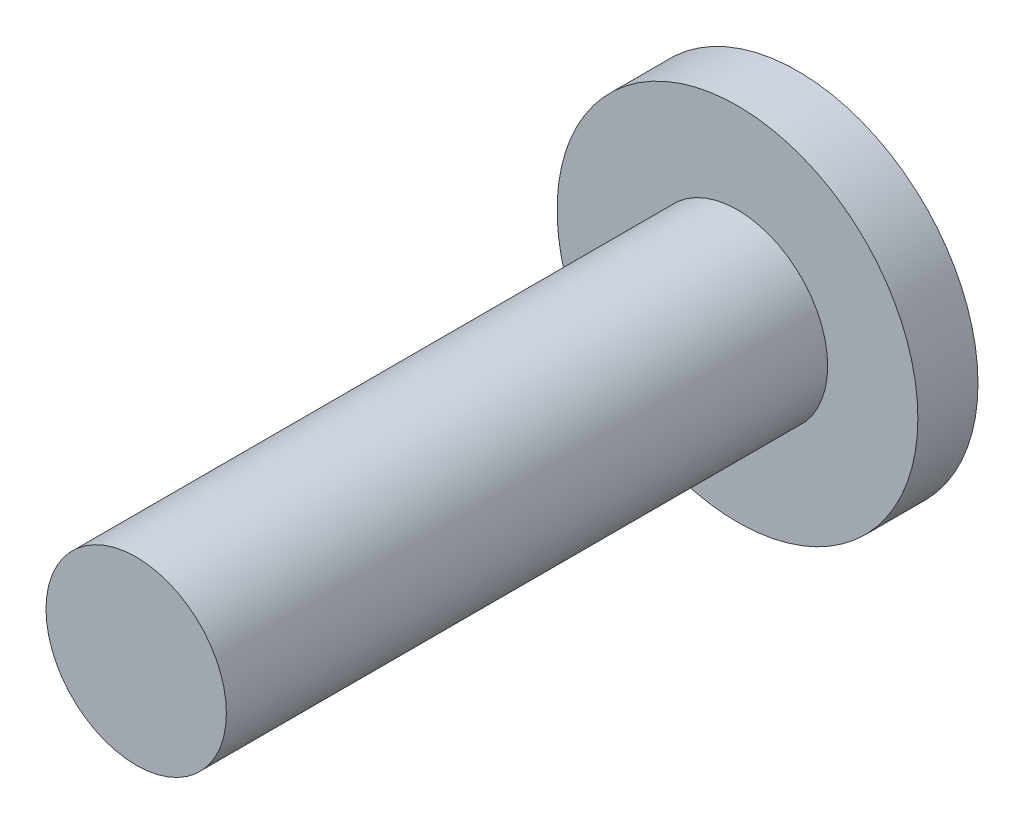
ISO-10303-21;
HEADER;
FILE_DESCRIPTION(('STEP AP214'),'2;1');
FILE_NAME('part.step','',(''),(''),'','','');
FILE_SCHEMA(('AUTOMOTIVE_DESIGN { 1 0 10303 214 1 1 1 1 }'));
ENDSEC;
DATA;
#1=APPLICATION_CONTEXT('core data for automotive mechanical design processes');
#2=APPLICATION_PROTOCOL_DEFINITION('international standard','automotive_design',2000,#1);
#3=PRODUCT_CONTEXT('',#1,'mechanical');
#4=PRODUCT('Part','Part','',(#3));
#5=PRODUCT_RELATED_PRODUCT_CATEGORY('part','',(#4));
#6=PRODUCT_DEFINITION_FORMATION('','',#4);
#7=PRODUCT_DEFINITION_CONTEXT('part definition',#1,'design');
#8=PRODUCT_DEFINITION('design','',#6,#7);
#9=PRODUCT_DEFINITION_SHAPE('','',#8);
#10=(LENGTH_UNIT() NAMED_UNIT(*) SI_UNIT(.MILLI.,.METRE.));
#11=(NAMED_UNIT(*) PLANE_ANGLE_UNIT() SI_UNIT($,.RADIAN.));
#12=(NAMED_UNIT(*) SI_UNIT($,.STERADIAN.) SOLID_ANGLE_UNIT());
#13=UNCERTAINTY_MEASURE_WITH_UNIT(LENGTH_MEASURE(1.E-05),#10,'distance_accuracy_value','');
#14=(GEOMETRIC_REPRESENTATION_CONTEXT(3) GLOBAL_UNCERTAINTY_ASSIGNED_CONTEXT((#13)) GLOBAL_UNIT_ASSIGNED_CONTEXT((#10,
#11,#12)) REPRESENTATION_CONTEXT('',''));
#15=CARTESIAN_POINT('',(0.,0.,0.));
#16=DIRECTION('',(0.,0.,1.));
#17=DIRECTION('',(1.,0.,0.));
#18=AXIS2_PLACEMENT_3D('',#15,#16,#17);
#19=CARTESIAN_POINT('',(0.,0.,1.));
#20=DIRECTION('',(0.,0.,-1.));
#21=DIRECTION('',(-1.,0.,0.));
#22=AXIS2_PLACEMENT_3D('',#19,#20,#21);
#23=CYLINDRICAL_SURFACE('',#22,3.);
#24=CARTESIAN_POINT('',(0.,0.,1.));
#25=DIRECTION('',(0.,0.,1.));
#26=DIRECTION('',(1.,0.,0.));
#27=AXIS2_PLACEMENT_3D('',#24,#25,#26);
#28=CIRCLE('',#27,3.);
#29=CARTESIAN_POINT('',(3.,0.,1.));
#30=VERTEX_POINT('',#29);
#31=EDGE_CURVE('E45',#30,#30,#28,.T.);
#32=ORIENTED_EDGE('',*,*,#31,.F.);
#33=EDGE_LOOP('',(#32));
#34=FACE_BOUND('',#33,.T.);
#35=CARTESIAN_POINT('',(0.,0.,0.));
#36=DIRECTION('',(0.,0.,1.));
#37=DIRECTION('',(1.,0.,0.));
#38=AXIS2_PLACEMENT_3D('',#35,#36,#37);
#39=CIRCLE('',#38,3.);
#40=CARTESIAN_POINT('',(3.,0.,0.));
#41=VERTEX_POINT('',#40);
#42=EDGE_CURVE('E40',#41,#41,#39,.T.);
#43=ORIENTED_EDGE('',*,*,#42,.T.);
#44=EDGE_LOOP('',(#43));
#45=FACE_BOUND('',#44,.T.);
#46=ADVANCED_FACE('F37',(#34,#45),#23,.T.);
#47=CARTESIAN_POINT('',(0.,0.,1.));
#48=DIRECTION('',(0.,0.,1.));
#49=DIRECTION('',(1.,0.,0.));
#50=AXIS2_PLACEMENT_3D('',#47,#48,#49);
#51=PLANE('',#50);
#52=CARTESIAN_POINT('',(0.,0.,1.));
#53=DIRECTION('',(0.,0.,1.));
#54=DIRECTION('',(1.,0.,0.));
#55=AXIS2_PLACEMENT_3D('',#52,#53,#54);
#56=CIRCLE('',#55,1.5);
#57=CARTESIAN_POINT('',(1.5,0.,1.));
#58=VERTEX_POINT('',#57);
#59=EDGE_CURVE('E10',#58,#58,#56,.T.);
#60=ORIENTED_EDGE('',*,*,#59,.F.);
#61=EDGE_LOOP('',(#60));
#62=FACE_BOUND('',#61,.T.);
#63=ORIENTED_EDGE('',*,*,#31,.T.);
#64=EDGE_LOOP('',(#63));
#65=FACE_BOUND('',#64,.T.);
#66=ADVANCED_FACE('F65',(#62,#65),#51,.T.);
#67=CARTESIAN_POINT('',(0.,0.,0.));
#68=DIRECTION('',(0.,0.,1.));
#69=DIRECTION('',(1.,0.,0.));
#70=AXIS2_PLACEMENT_3D('',#67,#68,#69);
#71=PLANE('',#70);
#72=ORIENTED_EDGE('',*,*,#42,.F.);
#73=EDGE_LOOP('',(#72));
#74=FACE_BOUND('',#73,.T.);
#75=ADVANCED_FACE('F62',(#74),#71,.F.);
#76=CARTESIAN_POINT('',(0.,0.,11.));
#77=DIRECTION('',(0.,0.,-1.));
#78=DIRECTION('',(-1.,0.,0.));
#79=AXIS2_PLACEMENT_3D('',#76,#77,#78);
#80=CYLINDRICAL_SURFACE('',#79,1.5);
#81=CARTESIAN_POINT('',(0.,0.,11.));
#82=DIRECTION('',(0.,0.,1.));
#83=DIRECTION('',(1.,0.,0.));
#84=AXIS2_PLACEMENT_3D('',#81,#82,#83);
#85=CIRCLE('',#84,1.5);
#86=CARTESIAN_POINT('',(1.5,0.,11.));
#87=VERTEX_POINT('',#86);
#88=EDGE_CURVE('E52',#87,#87,#85,.T.);
#89=ORIENTED_EDGE('',*,*,#88,.F.);
#90=EDGE_LOOP('',(#89));
#91=FACE_BOUND('',#90,.T.);
#92=ORIENTED_EDGE('',*,*,#59,.T.);
#93=EDGE_LOOP('',(#92));
#94=FACE_BOUND('',#93,.T.);
#95=ADVANCED_FACE('F64',(#91,#94),#80,.T.);
#96=CARTESIAN_POINT('',(0.,0.,11.));
#97=DIRECTION('',(0.,0.,1.));
#98=DIRECTION('',(1.,0.,0.));
#99=AXIS2_PLACEMENT_3D('',#96,#97,#98);
#100=PLANE('',#99);
#101=ORIENTED_EDGE('',*,*,#88,.T.);
#102=EDGE_LOOP('',(#101));
#103=FACE_BOUND('',#102,.T.);
#104=ADVANCED_FACE('F70',(#103),#100,.T.);
#105=CLOSED_SHELL('',(#46,#66,#75,#95,#104));
#106=MANIFOLD_SOLID_BREP('B2',#105);
#107=ADVANCED_BREP_SHAPE_REPRESENTATION('',(#18,#106),#14);
#108=SHAPE_DEFINITION_REPRESENTATION(#9,#107);
ENDSEC;
END-ISO-10303-21;
